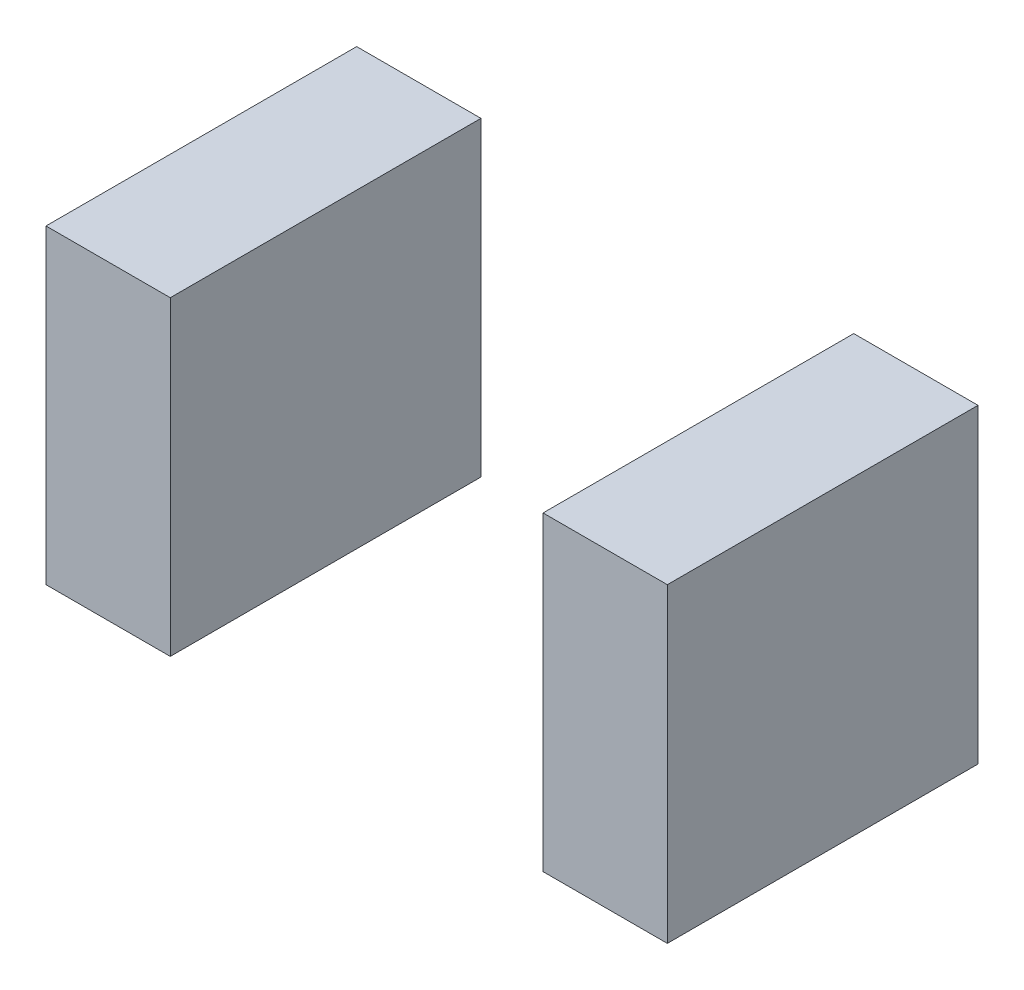
ISO-10303-21;
HEADER;
FILE_DESCRIPTION(('STEP AP214'),'2;1');
FILE_NAME('part.step','',(''),(''),'','','');
FILE_SCHEMA(('AUTOMOTIVE_DESIGN { 1 0 10303 214 1 1 1 1 }'));
ENDSEC;
DATA;
#1=APPLICATION_CONTEXT('core data for automotive mechanical design processes');
#2=APPLICATION_PROTOCOL_DEFINITION('international standard','automotive_design',2000,#1);
#3=PRODUCT_CONTEXT('',#1,'mechanical');
#4=PRODUCT('Part','Part','',(#3));
#5=PRODUCT_RELATED_PRODUCT_CATEGORY('part','',(#4));
#6=PRODUCT_DEFINITION_FORMATION('','',#4);
#7=PRODUCT_DEFINITION_CONTEXT('part definition',#1,'design');
#8=PRODUCT_DEFINITION('design','',#6,#7);
#9=PRODUCT_DEFINITION_SHAPE('','',#8);
#10=(LENGTH_UNIT() NAMED_UNIT(*) SI_UNIT(.MILLI.,.METRE.));
#11=(NAMED_UNIT(*) PLANE_ANGLE_UNIT() SI_UNIT($,.RADIAN.));
#12=(NAMED_UNIT(*) SI_UNIT($,.STERADIAN.) SOLID_ANGLE_UNIT());
#13=UNCERTAINTY_MEASURE_WITH_UNIT(LENGTH_MEASURE(1.E-05),#10,'distance_accuracy_value','');
#14=(GEOMETRIC_REPRESENTATION_CONTEXT(3) GLOBAL_UNCERTAINTY_ASSIGNED_CONTEXT((#13)) GLOBAL_UNIT_ASSIGNED_CONTEXT((#10,
#11,#12)) REPRESENTATION_CONTEXT('',''));
#15=CARTESIAN_POINT('',(0.,0.,0.));
#16=DIRECTION('',(0.,0.,1.));
#17=DIRECTION('',(1.,0.,0.));
#18=AXIS2_PLACEMENT_3D('',#15,#16,#17);
#19=CARTESIAN_POINT('',(24.495765455067,-15.90919741325,-12.69303980818));
#20=DIRECTION('',(-1.,0.,0.));
#21=DIRECTION('',(0.,0.,1.));
#22=AXIS2_PLACEMENT_3D('',#19,#20,#21);
#23=PLANE('',#22);
#24=DIRECTION('',(0.,0.,-1.));
#25=VECTOR('',#24,1.);
#26=CARTESIAN_POINT('',(24.495765455067,-15.40919741325,-12.69303980818));
#27=LINE('',#26,#25);
#28=CARTESIAN_POINT('',(24.495765455067,-15.40919741325,-13.19303980818));
#29=VERTEX_POINT('',#28);
#30=CARTESIAN_POINT('',(24.495765455067,-15.40919741325,-12.69303980818));
#31=VERTEX_POINT('',#30);
#32=EDGE_CURVE('P0_E20',#29,#31,#27,.F.);
#33=ORIENTED_EDGE('',*,*,#32,.T.);
#34=DIRECTION('',(0.,1.,0.));
#35=VECTOR('',#34,1.);
#36=CARTESIAN_POINT('',(24.495765455067,-15.90919741325,-12.69303980818));
#37=LINE('',#36,#35);
#38=CARTESIAN_POINT('',(24.495765455067,-15.90919741325,-12.69303980818));
#39=VERTEX_POINT('',#38);
#40=EDGE_CURVE('P0_E55',#39,#31,#37,.T.);
#41=ORIENTED_EDGE('',*,*,#40,.F.);
#42=DIRECTION('',(0.,0.,1.));
#43=VECTOR('',#42,1.);
#44=CARTESIAN_POINT('',(24.495765455067,-15.90919741325,-12.69303980818));
#45=LINE('',#44,#43);
#46=CARTESIAN_POINT('',(24.495765455067,-15.90919741325,-13.19303980818));
#47=VERTEX_POINT('',#46);
#48=EDGE_CURVE('P0_E74',#39,#47,#45,.F.);
#49=ORIENTED_EDGE('',*,*,#48,.T.);
#50=DIRECTION('',(0.,1.,0.));
#51=VECTOR('',#50,1.);
#52=CARTESIAN_POINT('',(24.495765455067,-15.90919741325,-13.19303980818));
#53=LINE('',#52,#51);
#54=EDGE_CURVE('P0_E66',#47,#29,#53,.T.);
#55=ORIENTED_EDGE('',*,*,#54,.T.);
#56=EDGE_LOOP('',(#33,#41,#49,#55));
#57=FACE_BOUND('',#56,.T.);
#58=ADVANCED_FACE('P0_F17',(#57),#23,.F.);
#59=CARTESIAN_POINT('',(24.495765455067,-15.40919741325,-12.69303980818));
#60=DIRECTION('',(0.,-1.,0.));
#61=DIRECTION('',(0.,0.,-1.));
#62=AXIS2_PLACEMENT_3D('',#59,#60,#61);
#63=PLANE('',#62);
#64=DIRECTION('',(0.,0.,-1.));
#65=VECTOR('',#64,1.);
#66=CARTESIAN_POINT('',(24.295765455067,-15.40919741325,-12.69303980818));
#67=LINE('',#66,#65);
#68=CARTESIAN_POINT('',(24.295765455067,-15.40919741325,-13.19303980818));
#69=VERTEX_POINT('',#68);
#70=CARTESIAN_POINT('',(24.295765455067,-15.40919741325,-12.69303980818));
#71=VERTEX_POINT('',#70);
#72=EDGE_CURVE('P0_E72',#69,#71,#67,.F.);
#73=ORIENTED_EDGE('',*,*,#72,.T.);
#74=DIRECTION('',(1.,0.,0.));
#75=VECTOR('',#74,1.);
#76=CARTESIAN_POINT('',(24.295765455067,-15.40919741325,-12.69303980818));
#77=LINE('',#76,#75);
#78=EDGE_CURVE('P0_E62',#31,#71,#77,.F.);
#79=ORIENTED_EDGE('',*,*,#78,.F.);
#80=ORIENTED_EDGE('',*,*,#32,.F.);
#81=DIRECTION('',(1.,0.,0.));
#82=VECTOR('',#81,1.);
#83=CARTESIAN_POINT('',(24.295765455067,-15.40919741325,-13.19303980818));
#84=LINE('',#83,#82);
#85=EDGE_CURVE('P0_E80',#29,#69,#84,.F.);
#86=ORIENTED_EDGE('',*,*,#85,.T.);
#87=EDGE_LOOP('',(#73,#79,#80,#86));
#88=FACE_BOUND('',#87,.T.);
#89=ADVANCED_FACE('P0_F71',(#88),#63,.F.);
#90=CARTESIAN_POINT('',(24.295765455067,-15.90919741325,-12.69303980818));
#91=DIRECTION('',(0.,0.,1.));
#92=DIRECTION('',(1.,0.,0.));
#93=AXIS2_PLACEMENT_3D('',#90,#91,#92);
#94=PLANE('',#93);
#95=ORIENTED_EDGE('',*,*,#40,.T.);
#96=ORIENTED_EDGE('',*,*,#78,.T.);
#97=DIRECTION('',(0.,1.,0.));
#98=VECTOR('',#97,1.);
#99=CARTESIAN_POINT('',(24.295765455067,-15.40919741325,-12.69303980818));
#100=LINE('',#99,#98);
#101=CARTESIAN_POINT('',(24.295765455067,-15.90919741325,-12.69303980818));
#102=VERTEX_POINT('',#101);
#103=EDGE_CURVE('P0_E83',#71,#102,#100,.F.);
#104=ORIENTED_EDGE('',*,*,#103,.T.);
#105=DIRECTION('',(1.,0.,0.));
#106=VECTOR('',#105,1.);
#107=CARTESIAN_POINT('',(24.295765455067,-15.90919741325,-12.69303980818));
#108=LINE('',#107,#106);
#109=EDGE_CURVE('P0_E64',#102,#39,#108,.T.);
#110=ORIENTED_EDGE('',*,*,#109,.T.);
#111=EDGE_LOOP('',(#95,#96,#104,#110));
#112=FACE_BOUND('',#111,.T.);
#113=ADVANCED_FACE('P0_F59',(#112),#94,.T.);
#114=CARTESIAN_POINT('',(24.295765455067,-15.90919741325,-12.69303980818));
#115=DIRECTION('',(0.,1.,0.));
#116=DIRECTION('',(0.,0.,1.));
#117=AXIS2_PLACEMENT_3D('',#114,#115,#116);
#118=PLANE('',#117);
#119=ORIENTED_EDGE('',*,*,#48,.F.);
#120=ORIENTED_EDGE('',*,*,#109,.F.);
#121=DIRECTION('',(0.,0.,-1.));
#122=VECTOR('',#121,1.);
#123=CARTESIAN_POINT('',(24.295765455067,-15.90919741325,-12.69303980818));
#124=LINE('',#123,#122);
#125=CARTESIAN_POINT('',(24.295765455067,-15.90919741325,-13.19303980818));
#126=VERTEX_POINT('',#125);
#127=EDGE_CURVE('P0_E26',#102,#126,#124,.T.);
#128=ORIENTED_EDGE('',*,*,#127,.T.);
#129=DIRECTION('',(1.,0.,0.));
#130=VECTOR('',#129,1.);
#131=CARTESIAN_POINT('',(24.295765455067,-15.90919741325,-13.19303980818));
#132=LINE('',#131,#130);
#133=EDGE_CURVE('P0_E34',#126,#47,#132,.T.);
#134=ORIENTED_EDGE('',*,*,#133,.T.);
#135=EDGE_LOOP('',(#119,#120,#128,#134));
#136=FACE_BOUND('',#135,.T.);
#137=ADVANCED_FACE('P0_F88',(#136),#118,.F.);
#138=CARTESIAN_POINT('',(24.295765455067,-15.90919741325,-13.19303980818));
#139=DIRECTION('',(0.,0.,1.));
#140=DIRECTION('',(1.,0.,0.));
#141=AXIS2_PLACEMENT_3D('',#138,#139,#140);
#142=PLANE('',#141);
#143=ORIENTED_EDGE('',*,*,#85,.F.);
#144=ORIENTED_EDGE('',*,*,#54,.F.);
#145=ORIENTED_EDGE('',*,*,#133,.F.);
#146=DIRECTION('',(0.,1.,0.));
#147=VECTOR('',#146,1.);
#148=CARTESIAN_POINT('',(24.295765455067,-15.40919741325,-13.19303980818));
#149=LINE('',#148,#147);
#150=EDGE_CURVE('P0_E11',#126,#69,#149,.T.);
#151=ORIENTED_EDGE('',*,*,#150,.T.);
#152=EDGE_LOOP('',(#143,#144,#145,#151));
#153=FACE_BOUND('',#152,.T.);
#154=ADVANCED_FACE('P0_F91',(#153),#142,.F.);
#155=CARTESIAN_POINT('',(24.295765455067,-15.40919741325,-12.69303980818));
#156=DIRECTION('',(1.,0.,0.));
#157=DIRECTION('',(0.,0.,-1.));
#158=AXIS2_PLACEMENT_3D('',#155,#156,#157);
#159=PLANE('',#158);
#160=ORIENTED_EDGE('',*,*,#127,.F.);
#161=ORIENTED_EDGE('',*,*,#103,.F.);
#162=ORIENTED_EDGE('',*,*,#72,.F.);
#163=ORIENTED_EDGE('',*,*,#150,.F.);
#164=EDGE_LOOP('',(#160,#161,#162,#163));
#165=FACE_BOUND('',#164,.T.);
#166=ADVANCED_FACE('P0_F90',(#165),#159,.F.);
#167=CLOSED_SHELL('',(#58,#89,#113,#137,#154,#166));
#168=MANIFOLD_SOLID_BREP('P0_B1',#167);
#169=CARTESIAN_POINT('',(25.295765455067,-15.90919741325,-12.69303980818));
#170=DIRECTION('',(-1.,0.,0.));
#171=DIRECTION('',(0.,0.,1.));
#172=AXIS2_PLACEMENT_3D('',#169,#170,#171);
#173=PLANE('',#172);
#174=DIRECTION('',(0.,0.,-1.));
#175=VECTOR('',#174,1.);
#176=CARTESIAN_POINT('',(25.295765455067,-15.40919741325,-12.69303980818));
#177=LINE('',#176,#175);
#178=CARTESIAN_POINT('',(25.295765455067,-15.40919741325,-13.19303980818));
#179=VERTEX_POINT('',#178);
#180=CARTESIAN_POINT('',(25.295765455067,-15.40919741325,-12.69303980818));
#181=VERTEX_POINT('',#180);
#182=EDGE_CURVE('P1_E20',#179,#181,#177,.F.);
#183=ORIENTED_EDGE('',*,*,#182,.T.);
#184=DIRECTION('',(0.,1.,0.));
#185=VECTOR('',#184,1.);
#186=CARTESIAN_POINT('',(25.295765455067,-15.90919741325,-12.69303980818));
#187=LINE('',#186,#185);
#188=CARTESIAN_POINT('',(25.295765455067,-15.90919741325,-12.69303980818));
#189=VERTEX_POINT('',#188);
#190=EDGE_CURVE('P1_E55',#189,#181,#187,.T.);
#191=ORIENTED_EDGE('',*,*,#190,.F.);
#192=DIRECTION('',(0.,0.,1.));
#193=VECTOR('',#192,1.);
#194=CARTESIAN_POINT('',(25.295765455067,-15.90919741325,-12.69303980818));
#195=LINE('',#194,#193);
#196=CARTESIAN_POINT('',(25.295765455067,-15.90919741325,-13.19303980818));
#197=VERTEX_POINT('',#196);
#198=EDGE_CURVE('P1_E74',#189,#197,#195,.F.);
#199=ORIENTED_EDGE('',*,*,#198,.T.);
#200=DIRECTION('',(0.,1.,0.));
#201=VECTOR('',#200,1.);
#202=CARTESIAN_POINT('',(25.295765455067,-15.90919741325,-13.19303980818));
#203=LINE('',#202,#201);
#204=EDGE_CURVE('P1_E66',#197,#179,#203,.T.);
#205=ORIENTED_EDGE('',*,*,#204,.T.);
#206=EDGE_LOOP('',(#183,#191,#199,#205));
#207=FACE_BOUND('',#206,.T.);
#208=ADVANCED_FACE('P1_F17',(#207),#173,.F.);
#209=CARTESIAN_POINT('',(25.295765455067,-15.40919741325,-12.69303980818));
#210=DIRECTION('',(0.,-1.,0.));
#211=DIRECTION('',(0.,0.,-1.));
#212=AXIS2_PLACEMENT_3D('',#209,#210,#211);
#213=PLANE('',#212);
#214=DIRECTION('',(0.,0.,-1.));
#215=VECTOR('',#214,1.);
#216=CARTESIAN_POINT('',(25.095765455067,-15.40919741325,-12.69303980818));
#217=LINE('',#216,#215);
#218=CARTESIAN_POINT('',(25.095765455067,-15.40919741325,-13.19303980818));
#219=VERTEX_POINT('',#218);
#220=CARTESIAN_POINT('',(25.095765455067,-15.40919741325,-12.69303980818));
#221=VERTEX_POINT('',#220);
#222=EDGE_CURVE('P1_E72',#219,#221,#217,.F.);
#223=ORIENTED_EDGE('',*,*,#222,.T.);
#224=DIRECTION('',(1.,0.,0.));
#225=VECTOR('',#224,1.);
#226=CARTESIAN_POINT('',(25.095765455067,-15.40919741325,-12.69303980818));
#227=LINE('',#226,#225);
#228=EDGE_CURVE('P1_E62',#181,#221,#227,.F.);
#229=ORIENTED_EDGE('',*,*,#228,.F.);
#230=ORIENTED_EDGE('',*,*,#182,.F.);
#231=DIRECTION('',(1.,0.,0.));
#232=VECTOR('',#231,1.);
#233=CARTESIAN_POINT('',(25.095765455067,-15.40919741325,-13.19303980818));
#234=LINE('',#233,#232);
#235=EDGE_CURVE('P1_E80',#179,#219,#234,.F.);
#236=ORIENTED_EDGE('',*,*,#235,.T.);
#237=EDGE_LOOP('',(#223,#229,#230,#236));
#238=FACE_BOUND('',#237,.T.);
#239=ADVANCED_FACE('P1_F71',(#238),#213,.F.);
#240=CARTESIAN_POINT('',(25.095765455067,-15.90919741325,-12.69303980818));
#241=DIRECTION('',(0.,0.,1.));
#242=DIRECTION('',(1.,0.,0.));
#243=AXIS2_PLACEMENT_3D('',#240,#241,#242);
#244=PLANE('',#243);
#245=ORIENTED_EDGE('',*,*,#190,.T.);
#246=ORIENTED_EDGE('',*,*,#228,.T.);
#247=DIRECTION('',(0.,1.,0.));
#248=VECTOR('',#247,1.);
#249=CARTESIAN_POINT('',(25.095765455067,-15.40919741325,-12.69303980818));
#250=LINE('',#249,#248);
#251=CARTESIAN_POINT('',(25.095765455067,-15.90919741325,-12.69303980818));
#252=VERTEX_POINT('',#251);
#253=EDGE_CURVE('P1_E83',#221,#252,#250,.F.);
#254=ORIENTED_EDGE('',*,*,#253,.T.);
#255=DIRECTION('',(1.,0.,0.));
#256=VECTOR('',#255,1.);
#257=CARTESIAN_POINT('',(25.095765455067,-15.90919741325,-12.69303980818));
#258=LINE('',#257,#256);
#259=EDGE_CURVE('P1_E64',#252,#189,#258,.T.);
#260=ORIENTED_EDGE('',*,*,#259,.T.);
#261=EDGE_LOOP('',(#245,#246,#254,#260));
#262=FACE_BOUND('',#261,.T.);
#263=ADVANCED_FACE('P1_F59',(#262),#244,.T.);
#264=CARTESIAN_POINT('',(25.095765455067,-15.90919741325,-12.69303980818));
#265=DIRECTION('',(0.,1.,0.));
#266=DIRECTION('',(0.,0.,1.));
#267=AXIS2_PLACEMENT_3D('',#264,#265,#266);
#268=PLANE('',#267);
#269=ORIENTED_EDGE('',*,*,#198,.F.);
#270=ORIENTED_EDGE('',*,*,#259,.F.);
#271=DIRECTION('',(0.,0.,-1.));
#272=VECTOR('',#271,1.);
#273=CARTESIAN_POINT('',(25.095765455067,-15.90919741325,-12.69303980818));
#274=LINE('',#273,#272);
#275=CARTESIAN_POINT('',(25.095765455067,-15.90919741325,-13.19303980818));
#276=VERTEX_POINT('',#275);
#277=EDGE_CURVE('P1_E26',#252,#276,#274,.T.);
#278=ORIENTED_EDGE('',*,*,#277,.T.);
#279=DIRECTION('',(1.,0.,0.));
#280=VECTOR('',#279,1.);
#281=CARTESIAN_POINT('',(25.095765455067,-15.90919741325,-13.19303980818));
#282=LINE('',#281,#280);
#283=EDGE_CURVE('P1_E34',#276,#197,#282,.T.);
#284=ORIENTED_EDGE('',*,*,#283,.T.);
#285=EDGE_LOOP('',(#269,#270,#278,#284));
#286=FACE_BOUND('',#285,.T.);
#287=ADVANCED_FACE('P1_F88',(#286),#268,.F.);
#288=CARTESIAN_POINT('',(25.095765455067,-15.90919741325,-13.19303980818));
#289=DIRECTION('',(0.,0.,1.));
#290=DIRECTION('',(1.,0.,0.));
#291=AXIS2_PLACEMENT_3D('',#288,#289,#290);
#292=PLANE('',#291);
#293=ORIENTED_EDGE('',*,*,#235,.F.);
#294=ORIENTED_EDGE('',*,*,#204,.F.);
#295=ORIENTED_EDGE('',*,*,#283,.F.);
#296=DIRECTION('',(0.,1.,0.));
#297=VECTOR('',#296,1.);
#298=CARTESIAN_POINT('',(25.095765455067,-15.40919741325,-13.19303980818));
#299=LINE('',#298,#297);
#300=EDGE_CURVE('P1_E11',#276,#219,#299,.T.);
#301=ORIENTED_EDGE('',*,*,#300,.T.);
#302=EDGE_LOOP('',(#293,#294,#295,#301));
#303=FACE_BOUND('',#302,.T.);
#304=ADVANCED_FACE('P1_F91',(#303),#292,.F.);
#305=CARTESIAN_POINT('',(25.095765455067,-15.40919741325,-12.69303980818));
#306=DIRECTION('',(1.,0.,0.));
#307=DIRECTION('',(0.,0.,-1.));
#308=AXIS2_PLACEMENT_3D('',#305,#306,#307);
#309=PLANE('',#308);
#310=ORIENTED_EDGE('',*,*,#277,.F.);
#311=ORIENTED_EDGE('',*,*,#253,.F.);
#312=ORIENTED_EDGE('',*,*,#222,.F.);
#313=ORIENTED_EDGE('',*,*,#300,.F.);
#314=EDGE_LOOP('',(#310,#311,#312,#313));
#315=FACE_BOUND('',#314,.T.);
#316=ADVANCED_FACE('P1_F90',(#315),#309,.F.);
#317=CLOSED_SHELL('',(#208,#239,#263,#287,#304,#316));
#318=MANIFOLD_SOLID_BREP('P1_B1',#317);
#319=ADVANCED_BREP_SHAPE_REPRESENTATION('',(#18,#168,#318),#14);
#320=SHAPE_DEFINITION_REPRESENTATION(#9,#319);
ENDSEC;
END-ISO-10303-21;
